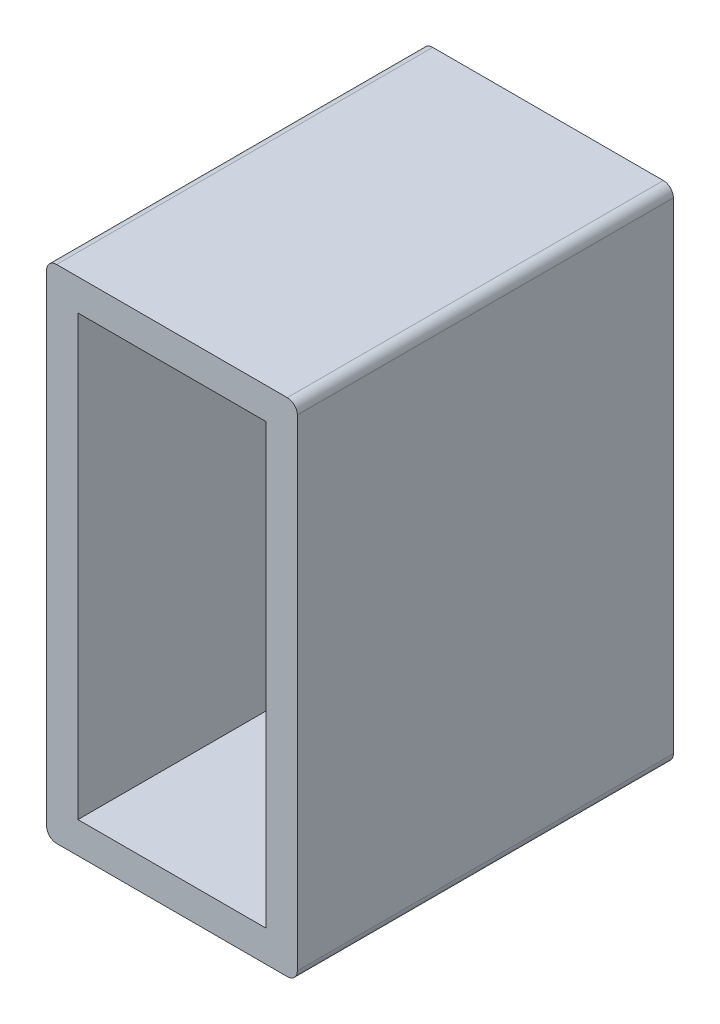
ISO-10303-21;
HEADER;
FILE_DESCRIPTION(('STEP AP214'),'2;1');
FILE_NAME('part.step','',(''),(''),'','','');
FILE_SCHEMA(('AUTOMOTIVE_DESIGN { 1 0 10303 214 1 1 1 1 }'));
ENDSEC;
DATA;
#1=APPLICATION_CONTEXT('core data for automotive mechanical design processes');
#2=APPLICATION_PROTOCOL_DEFINITION('international standard','automotive_design',2000,#1);
#3=PRODUCT_CONTEXT('',#1,'mechanical');
#4=PRODUCT('Part','Part','',(#3));
#5=PRODUCT_RELATED_PRODUCT_CATEGORY('part','',(#4));
#6=PRODUCT_DEFINITION_FORMATION('','',#4);
#7=PRODUCT_DEFINITION_CONTEXT('part definition',#1,'design');
#8=PRODUCT_DEFINITION('design','',#6,#7);
#9=PRODUCT_DEFINITION_SHAPE('','',#8);
#10=(LENGTH_UNIT() NAMED_UNIT(*) SI_UNIT(.MILLI.,.METRE.));
#11=(NAMED_UNIT(*) PLANE_ANGLE_UNIT() SI_UNIT($,.RADIAN.));
#12=(NAMED_UNIT(*) SI_UNIT($,.STERADIAN.) SOLID_ANGLE_UNIT());
#13=UNCERTAINTY_MEASURE_WITH_UNIT(LENGTH_MEASURE(1.E-05),#10,'distance_accuracy_value','');
#14=(GEOMETRIC_REPRESENTATION_CONTEXT(3) GLOBAL_UNCERTAINTY_ASSIGNED_CONTEXT((#13)) GLOBAL_UNIT_ASSIGNED_CONTEXT((#10,
#11,#12)) REPRESENTATION_CONTEXT('',''));
#15=CARTESIAN_POINT('',(0.,0.,0.));
#16=DIRECTION('',(0.,0.,1.));
#17=DIRECTION('',(1.,0.,0.));
#18=AXIS2_PLACEMENT_3D('',#15,#16,#17);
#19=CARTESIAN_POINT('',(-11.684,-24.384,19.05));
#20=DIRECTION('',(0.,0.,1.));
#21=DIRECTION('',(1.,0.,0.));
#22=AXIS2_PLACEMENT_3D('',#19,#20,#21);
#23=PLANE('',#22);
#24=CARTESIAN_POINT('',(-11.684,-24.384,19.05));
#25=DIRECTION('',(0.,0.,1.));
#26=DIRECTION('',(1.,0.,0.));
#27=AXIS2_PLACEMENT_3D('',#24,#25,#26);
#28=CIRCLE('',#27,1.016);
#29=CARTESIAN_POINT('',(-12.7,-24.384,19.05));
#30=VERTEX_POINT('',#29);
#31=CARTESIAN_POINT('',(-11.684,-25.4,19.05));
#32=VERTEX_POINT('',#31);
#33=EDGE_CURVE('E157',#30,#32,#28,.T.);
#34=ORIENTED_EDGE('',*,*,#33,.T.);
#35=DIRECTION('',(1.,0.,0.));
#36=VECTOR('',#35,1.);
#37=CARTESIAN_POINT('',(-11.684,-25.4,19.05));
#38=LINE('',#37,#36);
#39=CARTESIAN_POINT('',(11.684,-25.4,19.05));
#40=VERTEX_POINT('',#39);
#41=EDGE_CURVE('E160',#32,#40,#38,.T.);
#42=ORIENTED_EDGE('',*,*,#41,.T.);
#43=CARTESIAN_POINT('',(11.684,-24.384,19.05));
#44=DIRECTION('',(0.,0.,1.));
#45=DIRECTION('',(1.,0.,0.));
#46=AXIS2_PLACEMENT_3D('',#43,#44,#45);
#47=CIRCLE('',#46,1.016);
#48=CARTESIAN_POINT('',(12.7,-24.384,19.05));
#49=VERTEX_POINT('',#48);
#50=EDGE_CURVE('E163',#40,#49,#47,.T.);
#51=ORIENTED_EDGE('',*,*,#50,.T.);
#52=DIRECTION('',(0.,1.,0.));
#53=VECTOR('',#52,1.);
#54=CARTESIAN_POINT('',(12.7,-24.384,19.05));
#55=LINE('',#54,#53);
#56=CARTESIAN_POINT('',(12.7,24.384,19.05));
#57=VERTEX_POINT('',#56);
#58=EDGE_CURVE('E165',#49,#57,#55,.T.);
#59=ORIENTED_EDGE('',*,*,#58,.T.);
#60=CARTESIAN_POINT('',(11.684,24.384,19.05));
#61=DIRECTION('',(0.,0.,1.));
#62=DIRECTION('',(1.,0.,0.));
#63=AXIS2_PLACEMENT_3D('',#60,#61,#62);
#64=CIRCLE('',#63,1.016);
#65=CARTESIAN_POINT('',(11.684,25.4,19.05));
#66=VERTEX_POINT('',#65);
#67=EDGE_CURVE('E167',#57,#66,#64,.T.);
#68=ORIENTED_EDGE('',*,*,#67,.T.);
#69=DIRECTION('',(-1.,0.,0.));
#70=VECTOR('',#69,1.);
#71=CARTESIAN_POINT('',(-11.684,25.4,19.05));
#72=LINE('',#71,#70);
#73=CARTESIAN_POINT('',(-11.684,25.4,19.05));
#74=VERTEX_POINT('',#73);
#75=EDGE_CURVE('E169',#66,#74,#72,.T.);
#76=ORIENTED_EDGE('',*,*,#75,.T.);
#77=CARTESIAN_POINT('',(-11.684,24.384,19.05));
#78=DIRECTION('',(0.,0.,1.));
#79=DIRECTION('',(1.,0.,0.));
#80=AXIS2_PLACEMENT_3D('',#77,#78,#79);
#81=CIRCLE('',#80,1.016);
#82=CARTESIAN_POINT('',(-12.7,24.384,19.05));
#83=VERTEX_POINT('',#82);
#84=EDGE_CURVE('E171',#74,#83,#81,.T.);
#85=ORIENTED_EDGE('',*,*,#84,.T.);
#86=DIRECTION('',(0.,-1.,0.));
#87=VECTOR('',#86,1.);
#88=CARTESIAN_POINT('',(-12.7,-24.384,19.05));
#89=LINE('',#88,#87);
#90=EDGE_CURVE('E173',#83,#30,#89,.T.);
#91=ORIENTED_EDGE('',*,*,#90,.T.);
#92=EDGE_LOOP('',(#34,#42,#51,#59,#68,#76,#85,#91));
#93=FACE_BOUND('',#92,.T.);
#94=DIRECTION('',(1.,0.,0.));
#95=VECTOR('',#94,1.);
#96=CARTESIAN_POINT('',(-9.525,-22.225,19.05));
#97=LINE('',#96,#95);
#98=CARTESIAN_POINT('',(-9.525,-22.225,19.05));
#99=VERTEX_POINT('',#98);
#100=CARTESIAN_POINT('',(9.525,-22.225,19.05));
#101=VERTEX_POINT('',#100);
#102=EDGE_CURVE('E129',#99,#101,#97,.T.);
#103=ORIENTED_EDGE('',*,*,#102,.F.);
#104=DIRECTION('',(0.,-1.,0.));
#105=VECTOR('',#104,1.);
#106=CARTESIAN_POINT('',(-9.525,-22.225,19.05));
#107=LINE('',#106,#105);
#108=CARTESIAN_POINT('',(-9.525,22.225,19.05));
#109=VERTEX_POINT('',#108);
#110=EDGE_CURVE('E121',#109,#99,#107,.T.);
#111=ORIENTED_EDGE('',*,*,#110,.F.);
#112=DIRECTION('',(-1.,0.,0.));
#113=VECTOR('',#112,1.);
#114=CARTESIAN_POINT('',(-9.525,22.225,19.05));
#115=LINE('',#114,#113);
#116=CARTESIAN_POINT('',(9.525,22.225,19.05));
#117=VERTEX_POINT('',#116);
#118=EDGE_CURVE('E143',#117,#109,#115,.T.);
#119=ORIENTED_EDGE('',*,*,#118,.F.);
#120=DIRECTION('',(0.,1.,0.));
#121=VECTOR('',#120,1.);
#122=CARTESIAN_POINT('',(9.525,-22.225,19.05));
#123=LINE('',#122,#121);
#124=EDGE_CURVE('E141',#101,#117,#123,.T.);
#125=ORIENTED_EDGE('',*,*,#124,.F.);
#126=EDGE_LOOP('',(#103,#111,#119,#125));
#127=FACE_BOUND('',#126,.T.);
#128=ADVANCED_FACE('F32',(#93,#127),#23,.T.);
#129=CARTESIAN_POINT('',(-11.684,-24.384,-19.05));
#130=DIRECTION('',(0.,0.,1.));
#131=DIRECTION('',(1.,0.,0.));
#132=AXIS2_PLACEMENT_3D('',#129,#130,#131);
#133=PLANE('',#132);
#134=CARTESIAN_POINT('',(-11.684,-24.384,-19.05));
#135=DIRECTION('',(0.,0.,1.));
#136=DIRECTION('',(1.,0.,0.));
#137=AXIS2_PLACEMENT_3D('',#134,#135,#136);
#138=CIRCLE('',#137,1.016);
#139=CARTESIAN_POINT('',(-12.7,-24.384,-19.05));
#140=VERTEX_POINT('',#139);
#141=CARTESIAN_POINT('',(-11.684,-25.4,-19.05));
#142=VERTEX_POINT('',#141);
#143=EDGE_CURVE('E137',#140,#142,#138,.T.);
#144=ORIENTED_EDGE('',*,*,#143,.F.);
#145=DIRECTION('',(0.,-1.,0.));
#146=VECTOR('',#145,1.);
#147=CARTESIAN_POINT('',(-12.7,-24.384,-19.05));
#148=LINE('',#147,#146);
#149=CARTESIAN_POINT('',(-12.7,24.384,-19.05));
#150=VERTEX_POINT('',#149);
#151=EDGE_CURVE('E161',#150,#140,#148,.T.);
#152=ORIENTED_EDGE('',*,*,#151,.F.);
#153=CARTESIAN_POINT('',(-11.684,24.384,-19.05));
#154=DIRECTION('',(0.,0.,1.));
#155=DIRECTION('',(1.,0.,0.));
#156=AXIS2_PLACEMENT_3D('',#153,#154,#155);
#157=CIRCLE('',#156,1.016);
#158=CARTESIAN_POINT('',(-11.684,25.4,-19.05));
#159=VERTEX_POINT('',#158);
#160=EDGE_CURVE('E188',#159,#150,#157,.T.);
#161=ORIENTED_EDGE('',*,*,#160,.F.);
#162=DIRECTION('',(-1.,0.,0.));
#163=VECTOR('',#162,1.);
#164=CARTESIAN_POINT('',(-11.684,25.4,-19.05));
#165=LINE('',#164,#163);
#166=CARTESIAN_POINT('',(11.684,25.4,-19.05));
#167=VERTEX_POINT('',#166);
#168=EDGE_CURVE('E186',#167,#159,#165,.T.);
#169=ORIENTED_EDGE('',*,*,#168,.F.);
#170=CARTESIAN_POINT('',(11.684,24.384,-19.05));
#171=DIRECTION('',(0.,0.,1.));
#172=DIRECTION('',(1.,0.,0.));
#173=AXIS2_PLACEMENT_3D('',#170,#171,#172);
#174=CIRCLE('',#173,1.016);
#175=CARTESIAN_POINT('',(12.7,24.384,-19.05));
#176=VERTEX_POINT('',#175);
#177=EDGE_CURVE('E184',#176,#167,#174,.T.);
#178=ORIENTED_EDGE('',*,*,#177,.F.);
#179=DIRECTION('',(0.,1.,0.));
#180=VECTOR('',#179,1.);
#181=CARTESIAN_POINT('',(12.7,-24.384,-19.05));
#182=LINE('',#181,#180);
#183=CARTESIAN_POINT('',(12.7,-24.384,-19.05));
#184=VERTEX_POINT('',#183);
#185=EDGE_CURVE('E182',#184,#176,#182,.T.);
#186=ORIENTED_EDGE('',*,*,#185,.F.);
#187=CARTESIAN_POINT('',(11.684,-24.384,-19.05));
#188=DIRECTION('',(0.,0.,1.));
#189=DIRECTION('',(1.,0.,0.));
#190=AXIS2_PLACEMENT_3D('',#187,#188,#189);
#191=CIRCLE('',#190,1.016);
#192=CARTESIAN_POINT('',(11.684,-25.4,-19.05));
#193=VERTEX_POINT('',#192);
#194=EDGE_CURVE('E180',#193,#184,#191,.T.);
#195=ORIENTED_EDGE('',*,*,#194,.F.);
#196=DIRECTION('',(1.,0.,0.));
#197=VECTOR('',#196,1.);
#198=CARTESIAN_POINT('',(-11.684,-25.4,-19.05));
#199=LINE('',#198,#197);
#200=EDGE_CURVE('E178',#142,#193,#199,.T.);
#201=ORIENTED_EDGE('',*,*,#200,.F.);
#202=EDGE_LOOP('',(#144,#152,#161,#169,#178,#186,#195,#201));
#203=FACE_BOUND('',#202,.T.);
#204=DIRECTION('',(0.,-1.,0.));
#205=VECTOR('',#204,1.);
#206=CARTESIAN_POINT('',(-9.525,-22.225,-19.05));
#207=LINE('',#206,#205);
#208=CARTESIAN_POINT('',(-9.525,22.225,-19.05));
#209=VERTEX_POINT('',#208);
#210=CARTESIAN_POINT('',(-9.525,-22.225,-19.05));
#211=VERTEX_POINT('',#210);
#212=EDGE_CURVE('E55',#209,#211,#207,.T.);
#213=ORIENTED_EDGE('',*,*,#212,.T.);
#214=DIRECTION('',(1.,0.,0.));
#215=VECTOR('',#214,1.);
#216=CARTESIAN_POINT('',(-9.525,-22.225,-19.05));
#217=LINE('',#216,#215);
#218=CARTESIAN_POINT('',(9.525,-22.225,-19.05));
#219=VERTEX_POINT('',#218);
#220=EDGE_CURVE('E136',#211,#219,#217,.T.);
#221=ORIENTED_EDGE('',*,*,#220,.T.);
#222=DIRECTION('',(0.,1.,0.));
#223=VECTOR('',#222,1.);
#224=CARTESIAN_POINT('',(9.525,-22.225,-19.05));
#225=LINE('',#224,#223);
#226=CARTESIAN_POINT('',(9.525,22.225,-19.05));
#227=VERTEX_POINT('',#226);
#228=EDGE_CURVE('E149',#219,#227,#225,.T.);
#229=ORIENTED_EDGE('',*,*,#228,.T.);
#230=DIRECTION('',(-1.,0.,0.));
#231=VECTOR('',#230,1.);
#232=CARTESIAN_POINT('',(-9.525,22.225,-19.05));
#233=LINE('',#232,#231);
#234=EDGE_CURVE('E130',#227,#209,#233,.T.);
#235=ORIENTED_EDGE('',*,*,#234,.T.);
#236=EDGE_LOOP('',(#213,#221,#229,#235));
#237=FACE_BOUND('',#236,.T.);
#238=ADVANCED_FACE('F218',(#203,#237),#133,.F.);
#239=CARTESIAN_POINT('',(-11.684,-24.384,19.05));
#240=DIRECTION('',(0.,0.,-1.));
#241=DIRECTION('',(-1.,0.,0.));
#242=AXIS2_PLACEMENT_3D('',#239,#240,#241);
#243=CYLINDRICAL_SURFACE('',#242,1.016);
#244=ORIENTED_EDGE('',*,*,#143,.T.);
#245=DIRECTION('',(0.,0.,-1.));
#246=VECTOR('',#245,1.);
#247=CARTESIAN_POINT('',(-11.684,-25.4,19.05));
#248=LINE('',#247,#246);
#249=EDGE_CURVE('E11',#32,#142,#248,.T.);
#250=ORIENTED_EDGE('',*,*,#249,.F.);
#251=ORIENTED_EDGE('',*,*,#33,.F.);
#252=DIRECTION('',(0.,0.,-1.));
#253=VECTOR('',#252,1.);
#254=CARTESIAN_POINT('',(-12.7,-24.384,19.05));
#255=LINE('',#254,#253);
#256=EDGE_CURVE('E175',#30,#140,#255,.T.);
#257=ORIENTED_EDGE('',*,*,#256,.T.);
#258=EDGE_LOOP('',(#244,#250,#251,#257));
#259=FACE_BOUND('',#258,.T.);
#260=ADVANCED_FACE('F34',(#259),#243,.T.);
#261=CARTESIAN_POINT('',(-11.684,-25.4,19.05));
#262=DIRECTION('',(0.,1.,0.));
#263=DIRECTION('',(0.,0.,1.));
#264=AXIS2_PLACEMENT_3D('',#261,#262,#263);
#265=PLANE('',#264);
#266=ORIENTED_EDGE('',*,*,#200,.T.);
#267=DIRECTION('',(0.,0.,-1.));
#268=VECTOR('',#267,1.);
#269=CARTESIAN_POINT('',(11.684,-25.4,19.05));
#270=LINE('',#269,#268);
#271=EDGE_CURVE('E40',#40,#193,#270,.T.);
#272=ORIENTED_EDGE('',*,*,#271,.F.);
#273=ORIENTED_EDGE('',*,*,#41,.F.);
#274=ORIENTED_EDGE('',*,*,#249,.T.);
#275=EDGE_LOOP('',(#266,#272,#273,#274));
#276=FACE_BOUND('',#275,.T.);
#277=ADVANCED_FACE('F235',(#276),#265,.F.);
#278=CARTESIAN_POINT('',(11.684,-24.384,19.05));
#279=DIRECTION('',(0.,0.,-1.));
#280=DIRECTION('',(-1.,0.,0.));
#281=AXIS2_PLACEMENT_3D('',#278,#279,#280);
#282=CYLINDRICAL_SURFACE('',#281,1.016);
#283=ORIENTED_EDGE('',*,*,#194,.T.);
#284=DIRECTION('',(0.,0.,-1.));
#285=VECTOR('',#284,1.);
#286=CARTESIAN_POINT('',(12.7,-24.384,19.05));
#287=LINE('',#286,#285);
#288=EDGE_CURVE('E205',#49,#184,#287,.T.);
#289=ORIENTED_EDGE('',*,*,#288,.F.);
#290=ORIENTED_EDGE('',*,*,#50,.F.);
#291=ORIENTED_EDGE('',*,*,#271,.T.);
#292=EDGE_LOOP('',(#283,#289,#290,#291));
#293=FACE_BOUND('',#292,.T.);
#294=ADVANCED_FACE('F212',(#293),#282,.T.);
#295=CARTESIAN_POINT('',(12.7,-24.384,19.05));
#296=DIRECTION('',(-1.,0.,0.));
#297=DIRECTION('',(0.,0.,1.));
#298=AXIS2_PLACEMENT_3D('',#295,#296,#297);
#299=PLANE('',#298);
#300=ORIENTED_EDGE('',*,*,#185,.T.);
#301=DIRECTION('',(0.,0.,-1.));
#302=VECTOR('',#301,1.);
#303=CARTESIAN_POINT('',(12.7,24.384,19.05));
#304=LINE('',#303,#302);
#305=EDGE_CURVE('E202',#57,#176,#304,.T.);
#306=ORIENTED_EDGE('',*,*,#305,.F.);
#307=ORIENTED_EDGE('',*,*,#58,.F.);
#308=ORIENTED_EDGE('',*,*,#288,.T.);
#309=EDGE_LOOP('',(#300,#306,#307,#308));
#310=FACE_BOUND('',#309,.T.);
#311=ADVANCED_FACE('F224',(#310),#299,.F.);
#312=CARTESIAN_POINT('',(11.684,24.384,19.05));
#313=DIRECTION('',(0.,0.,-1.));
#314=DIRECTION('',(-1.,0.,0.));
#315=AXIS2_PLACEMENT_3D('',#312,#313,#314);
#316=CYLINDRICAL_SURFACE('',#315,1.016);
#317=ORIENTED_EDGE('',*,*,#177,.T.);
#318=DIRECTION('',(0.,0.,-1.));
#319=VECTOR('',#318,1.);
#320=CARTESIAN_POINT('',(11.684,25.4,19.05));
#321=LINE('',#320,#319);
#322=EDGE_CURVE('E199',#66,#167,#321,.T.);
#323=ORIENTED_EDGE('',*,*,#322,.F.);
#324=ORIENTED_EDGE('',*,*,#67,.F.);
#325=ORIENTED_EDGE('',*,*,#305,.T.);
#326=EDGE_LOOP('',(#317,#323,#324,#325));
#327=FACE_BOUND('',#326,.T.);
#328=ADVANCED_FACE('F228',(#327),#316,.T.);
#329=CARTESIAN_POINT('',(-11.684,25.4,19.05));
#330=DIRECTION('',(0.,-1.,0.));
#331=DIRECTION('',(0.,0.,-1.));
#332=AXIS2_PLACEMENT_3D('',#329,#330,#331);
#333=PLANE('',#332);
#334=ORIENTED_EDGE('',*,*,#168,.T.);
#335=DIRECTION('',(0.,0.,-1.));
#336=VECTOR('',#335,1.);
#337=CARTESIAN_POINT('',(-11.684,25.4,19.05));
#338=LINE('',#337,#336);
#339=EDGE_CURVE('E196',#74,#159,#338,.T.);
#340=ORIENTED_EDGE('',*,*,#339,.F.);
#341=ORIENTED_EDGE('',*,*,#75,.F.);
#342=ORIENTED_EDGE('',*,*,#322,.T.);
#343=EDGE_LOOP('',(#334,#340,#341,#342));
#344=FACE_BOUND('',#343,.T.);
#345=ADVANCED_FACE('F248',(#344),#333,.F.);
#346=CARTESIAN_POINT('',(-11.684,24.384,19.05));
#347=DIRECTION('',(0.,0.,-1.));
#348=DIRECTION('',(-1.,0.,0.));
#349=AXIS2_PLACEMENT_3D('',#346,#347,#348);
#350=CYLINDRICAL_SURFACE('',#349,1.016);
#351=ORIENTED_EDGE('',*,*,#160,.T.);
#352=DIRECTION('',(0.,0.,-1.));
#353=VECTOR('',#352,1.);
#354=CARTESIAN_POINT('',(-12.7,24.384,19.05));
#355=LINE('',#354,#353);
#356=EDGE_CURVE('E193',#83,#150,#355,.T.);
#357=ORIENTED_EDGE('',*,*,#356,.F.);
#358=ORIENTED_EDGE('',*,*,#84,.F.);
#359=ORIENTED_EDGE('',*,*,#339,.T.);
#360=EDGE_LOOP('',(#351,#357,#358,#359));
#361=FACE_BOUND('',#360,.T.);
#362=ADVANCED_FACE('F246',(#361),#350,.T.);
#363=CARTESIAN_POINT('',(-12.7,-24.384,19.05));
#364=DIRECTION('',(1.,0.,0.));
#365=DIRECTION('',(0.,0.,-1.));
#366=AXIS2_PLACEMENT_3D('',#363,#364,#365);
#367=PLANE('',#366);
#368=ORIENTED_EDGE('',*,*,#151,.T.);
#369=ORIENTED_EDGE('',*,*,#256,.F.);
#370=ORIENTED_EDGE('',*,*,#90,.F.);
#371=ORIENTED_EDGE('',*,*,#356,.T.);
#372=EDGE_LOOP('',(#368,#369,#370,#371));
#373=FACE_BOUND('',#372,.T.);
#374=ADVANCED_FACE('F241',(#373),#367,.F.);
#375=CARTESIAN_POINT('',(-9.525,-22.225,19.05));
#376=DIRECTION('',(1.,0.,0.));
#377=DIRECTION('',(0.,0.,-1.));
#378=AXIS2_PLACEMENT_3D('',#375,#376,#377);
#379=PLANE('',#378);
#380=ORIENTED_EDGE('',*,*,#212,.F.);
#381=DIRECTION('',(0.,0.,-1.));
#382=VECTOR('',#381,1.);
#383=CARTESIAN_POINT('',(-9.525,22.225,19.05));
#384=LINE('',#383,#382);
#385=EDGE_CURVE('E125',#109,#209,#384,.T.);
#386=ORIENTED_EDGE('',*,*,#385,.F.);
#387=ORIENTED_EDGE('',*,*,#110,.T.);
#388=DIRECTION('',(0.,0.,-1.));
#389=VECTOR('',#388,1.);
#390=CARTESIAN_POINT('',(-9.525,-22.225,19.05));
#391=LINE('',#390,#389);
#392=EDGE_CURVE('E124',#99,#211,#391,.T.);
#393=ORIENTED_EDGE('',*,*,#392,.T.);
#394=EDGE_LOOP('',(#380,#386,#387,#393));
#395=FACE_BOUND('',#394,.T.);
#396=ADVANCED_FACE('F123',(#395),#379,.T.);
#397=CARTESIAN_POINT('',(-9.525,-22.225,19.05));
#398=DIRECTION('',(0.,1.,0.));
#399=DIRECTION('',(0.,0.,1.));
#400=AXIS2_PLACEMENT_3D('',#397,#398,#399);
#401=PLANE('',#400);
#402=ORIENTED_EDGE('',*,*,#220,.F.);
#403=ORIENTED_EDGE('',*,*,#392,.F.);
#404=ORIENTED_EDGE('',*,*,#102,.T.);
#405=DIRECTION('',(0.,0.,-1.));
#406=VECTOR('',#405,1.);
#407=CARTESIAN_POINT('',(9.525,-22.225,19.05));
#408=LINE('',#407,#406);
#409=EDGE_CURVE('E138',#101,#219,#408,.T.);
#410=ORIENTED_EDGE('',*,*,#409,.T.);
#411=EDGE_LOOP('',(#402,#403,#404,#410));
#412=FACE_BOUND('',#411,.T.);
#413=ADVANCED_FACE('F133',(#412),#401,.T.);
#414=CARTESIAN_POINT('',(9.525,-22.225,19.05));
#415=DIRECTION('',(-1.,0.,0.));
#416=DIRECTION('',(0.,-1.,0.));
#417=AXIS2_PLACEMENT_3D('',#414,#415,#416);
#418=PLANE('',#417);
#419=ORIENTED_EDGE('',*,*,#228,.F.);
#420=ORIENTED_EDGE('',*,*,#409,.F.);
#421=ORIENTED_EDGE('',*,*,#124,.T.);
#422=DIRECTION('',(0.,0.,-1.));
#423=VECTOR('',#422,1.);
#424=CARTESIAN_POINT('',(9.525,22.225,19.05));
#425=LINE('',#424,#423);
#426=EDGE_CURVE('E47',#117,#227,#425,.T.);
#427=ORIENTED_EDGE('',*,*,#426,.T.);
#428=EDGE_LOOP('',(#419,#420,#421,#427));
#429=FACE_BOUND('',#428,.T.);
#430=ADVANCED_FACE('F273',(#429),#418,.T.);
#431=CARTESIAN_POINT('',(-9.525,22.225,19.05));
#432=DIRECTION('',(0.,-1.,0.));
#433=DIRECTION('',(1.,0.,0.));
#434=AXIS2_PLACEMENT_3D('',#431,#432,#433);
#435=PLANE('',#434);
#436=ORIENTED_EDGE('',*,*,#234,.F.);
#437=ORIENTED_EDGE('',*,*,#426,.F.);
#438=ORIENTED_EDGE('',*,*,#118,.T.);
#439=ORIENTED_EDGE('',*,*,#385,.T.);
#440=EDGE_LOOP('',(#436,#437,#438,#439));
#441=FACE_BOUND('',#440,.T.);
#442=ADVANCED_FACE('F277',(#441),#435,.T.);
#443=CLOSED_SHELL('',(#128,#238,#260,#277,#294,#311,#328,#345,#362,#374,#396,#413,#430,#442));
#444=MANIFOLD_SOLID_BREP('B2',#443);
#445=ADVANCED_BREP_SHAPE_REPRESENTATION('',(#18,#444),#14);
#446=SHAPE_DEFINITION_REPRESENTATION(#9,#445);
ENDSEC;
END-ISO-10303-21;
